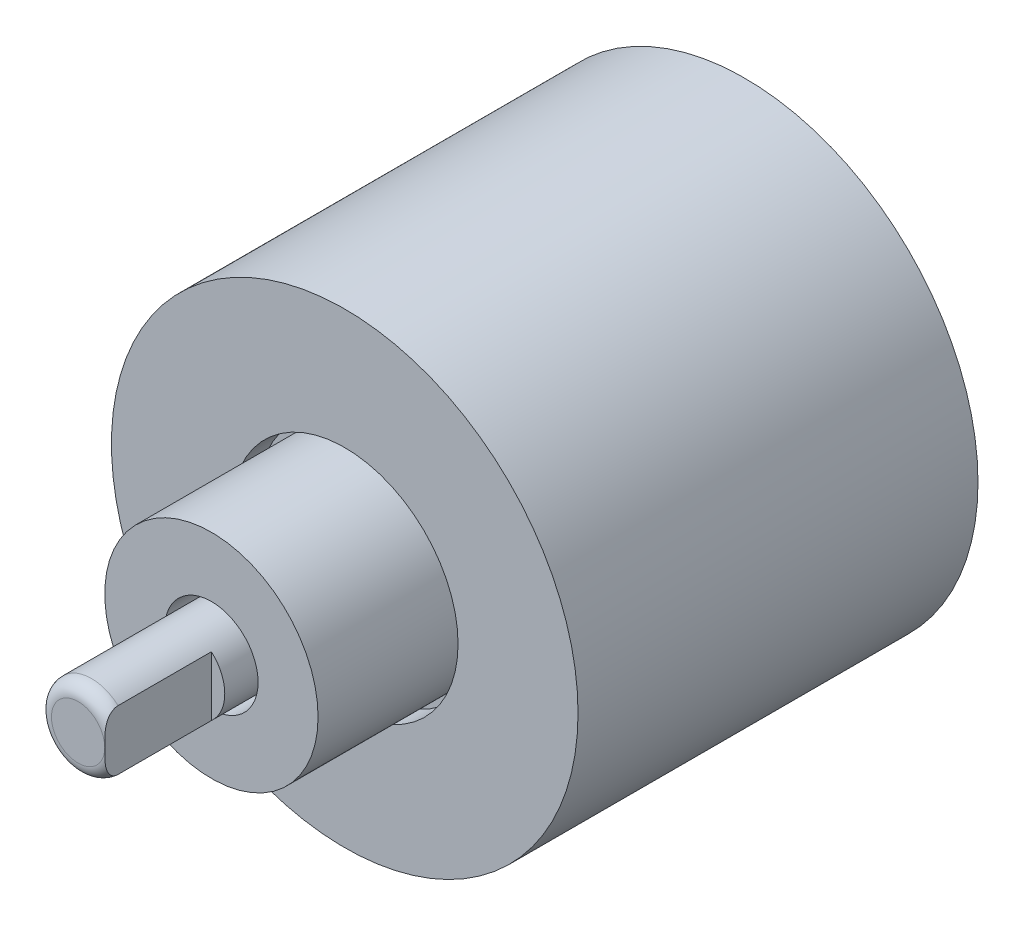
ISO-10303-21;
HEADER;
FILE_DESCRIPTION(('STEP AP214'),'2;1');
FILE_NAME('part.step','',(''),(''),'','','');
FILE_SCHEMA(('AUTOMOTIVE_DESIGN { 1 0 10303 214 1 1 1 1 }'));
ENDSEC;
DATA;
#1=APPLICATION_CONTEXT('core data for automotive mechanical design processes');
#2=APPLICATION_PROTOCOL_DEFINITION('international standard','automotive_design',2000,#1);
#3=PRODUCT_CONTEXT('',#1,'mechanical');
#4=PRODUCT('Part','Part','',(#3));
#5=PRODUCT_RELATED_PRODUCT_CATEGORY('part','',(#4));
#6=PRODUCT_DEFINITION_FORMATION('','',#4);
#7=PRODUCT_DEFINITION_CONTEXT('part definition',#1,'design');
#8=PRODUCT_DEFINITION('design','',#6,#7);
#9=PRODUCT_DEFINITION_SHAPE('','',#8);
#10=(LENGTH_UNIT() NAMED_UNIT(*) SI_UNIT(.MILLI.,.METRE.));
#11=(NAMED_UNIT(*) PLANE_ANGLE_UNIT() SI_UNIT($,.RADIAN.));
#12=(NAMED_UNIT(*) SI_UNIT($,.STERADIAN.) SOLID_ANGLE_UNIT());
#13=UNCERTAINTY_MEASURE_WITH_UNIT(LENGTH_MEASURE(1.E-05),#10,'distance_accuracy_value','');
#14=(GEOMETRIC_REPRESENTATION_CONTEXT(3) GLOBAL_UNCERTAINTY_ASSIGNED_CONTEXT((#13)) GLOBAL_UNIT_ASSIGNED_CONTEXT((#10,
#11,#12)) REPRESENTATION_CONTEXT('',''));
#15=CARTESIAN_POINT('',(0.,0.,0.));
#16=DIRECTION('',(0.,0.,1.));
#17=DIRECTION('',(1.,0.,0.));
#18=AXIS2_PLACEMENT_3D('',#15,#16,#17);
#19=CARTESIAN_POINT('',(0.,0.,40.));
#20=DIRECTION('',(0.,0.,1.));
#21=DIRECTION('',(1.,0.,0.));
#22=AXIS2_PLACEMENT_3D('',#19,#20,#21);
#23=PLANE('',#22);
#24=CARTESIAN_POINT('',(0.,0.,40.));
#25=DIRECTION('',(0.,0.,1.));
#26=DIRECTION('',(1.,0.,0.));
#27=AXIS2_PLACEMENT_3D('',#24,#25,#26);
#28=CIRCLE('',#27,3.5);
#29=CARTESIAN_POINT('',(3.5,0.,40.));
#30=VERTEX_POINT('',#29);
#31=EDGE_CURVE('E149',#30,#30,#28,.T.);
#32=ORIENTED_EDGE('',*,*,#31,.F.);
#33=EDGE_LOOP('',(#32));
#34=FACE_BOUND('',#33,.T.);
#35=CARTESIAN_POINT('',(0.,0.,40.));
#36=DIRECTION('',(0.,0.,1.));
#37=DIRECTION('',(1.,0.,0.));
#38=AXIS2_PLACEMENT_3D('',#35,#36,#37);
#39=CIRCLE('',#38,8.);
#40=CARTESIAN_POINT('',(8.,0.,40.));
#41=VERTEX_POINT('',#40);
#42=EDGE_CURVE('E133',#41,#41,#39,.T.);
#43=ORIENTED_EDGE('',*,*,#42,.T.);
#44=EDGE_LOOP('',(#43));
#45=FACE_BOUND('',#44,.T.);
#46=ADVANCED_FACE('F34',(#34,#45),#23,.T.);
#47=CARTESIAN_POINT('',(0.,0.,30.));
#48=DIRECTION('',(0.,0.,1.));
#49=DIRECTION('',(1.,0.,0.));
#50=AXIS2_PLACEMENT_3D('',#47,#48,#49);
#51=PLANE('',#50);
#52=CARTESIAN_POINT('',(0.,0.,30.));
#53=DIRECTION('',(0.,0.,1.));
#54=DIRECTION('',(1.,0.,0.));
#55=AXIS2_PLACEMENT_3D('',#52,#53,#54);
#56=CIRCLE('',#55,8.5);
#57=CARTESIAN_POINT('',(8.5,0.,30.));
#58=VERTEX_POINT('',#57);
#59=EDGE_CURVE('E140',#58,#58,#56,.T.);
#60=ORIENTED_EDGE('',*,*,#59,.F.);
#61=EDGE_LOOP('',(#60));
#62=FACE_BOUND('',#61,.T.);
#63=CARTESIAN_POINT('',(0.,0.,30.));
#64=DIRECTION('',(0.,0.,1.));
#65=DIRECTION('',(1.,0.,0.));
#66=AXIS2_PLACEMENT_3D('',#63,#64,#65);
#67=CIRCLE('',#66,17.5);
#68=CARTESIAN_POINT('',(17.5,0.,30.));
#69=VERTEX_POINT('',#68);
#70=EDGE_CURVE('E73',#69,#69,#67,.T.);
#71=ORIENTED_EDGE('',*,*,#70,.T.);
#72=EDGE_LOOP('',(#71));
#73=FACE_BOUND('',#72,.T.);
#74=ADVANCED_FACE('F114',(#62,#73),#51,.T.);
#75=CARTESIAN_POINT('',(0.,0.,30.));
#76=DIRECTION('',(0.,0.,-1.));
#77=DIRECTION('',(-1.,0.,0.));
#78=AXIS2_PLACEMENT_3D('',#75,#76,#77);
#79=CYLINDRICAL_SURFACE('',#78,17.5);
#80=ORIENTED_EDGE('',*,*,#70,.F.);
#81=EDGE_LOOP('',(#80));
#82=FACE_BOUND('',#81,.T.);
#83=CARTESIAN_POINT('',(0.,0.,0.));
#84=DIRECTION('',(0.,0.,1.));
#85=DIRECTION('',(1.,0.,0.));
#86=AXIS2_PLACEMENT_3D('',#83,#84,#85);
#87=CIRCLE('',#86,17.5);
#88=CARTESIAN_POINT('',(17.5,0.,0.));
#89=VERTEX_POINT('',#88);
#90=EDGE_CURVE('E77',#89,#89,#87,.T.);
#91=ORIENTED_EDGE('',*,*,#90,.T.);
#92=EDGE_LOOP('',(#91));
#93=FACE_BOUND('',#92,.T.);
#94=ADVANCED_FACE('F121',(#82,#93),#79,.T.);
#95=CARTESIAN_POINT('',(0.,0.,0.));
#96=DIRECTION('',(0.,0.,1.));
#97=DIRECTION('',(1.,0.,0.));
#98=AXIS2_PLACEMENT_3D('',#95,#96,#97);
#99=PLANE('',#98);
#100=ORIENTED_EDGE('',*,*,#90,.F.);
#101=EDGE_LOOP('',(#100));
#102=FACE_BOUND('',#101,.T.);
#103=ADVANCED_FACE('F110',(#102),#99,.F.);
#104=CARTESIAN_POINT('',(0.,0.,28.));
#105=DIRECTION('',(0.,0.,1.));
#106=DIRECTION('',(1.,0.,0.));
#107=AXIS2_PLACEMENT_3D('',#104,#105,#106);
#108=CYLINDRICAL_SURFACE('',#107,8.5);
#109=CARTESIAN_POINT('',(0.,0.,28.));
#110=DIRECTION('',(0.,0.,1.));
#111=DIRECTION('',(1.,0.,0.));
#112=AXIS2_PLACEMENT_3D('',#109,#110,#111);
#113=CIRCLE('',#112,8.5);
#114=CARTESIAN_POINT('',(8.5,0.,28.));
#115=VERTEX_POINT('',#114);
#116=EDGE_CURVE('E135',#115,#115,#113,.T.);
#117=ORIENTED_EDGE('',*,*,#116,.F.);
#118=EDGE_LOOP('',(#117));
#119=FACE_BOUND('',#118,.T.);
#120=ORIENTED_EDGE('',*,*,#59,.T.);
#121=EDGE_LOOP('',(#120));
#122=FACE_BOUND('',#121,.T.);
#123=ADVANCED_FACE('F106',(#119,#122),#108,.F.);
#124=CARTESIAN_POINT('',(0.,0.,28.));
#125=DIRECTION('',(0.,0.,1.));
#126=DIRECTION('',(1.,0.,0.));
#127=AXIS2_PLACEMENT_3D('',#124,#125,#126);
#128=PLANE('',#127);
#129=CARTESIAN_POINT('',(0.,0.,28.));
#130=DIRECTION('',(0.,0.,1.));
#131=DIRECTION('',(1.,0.,0.));
#132=AXIS2_PLACEMENT_3D('',#129,#130,#131);
#133=CIRCLE('',#132,8.);
#134=CARTESIAN_POINT('',(8.,0.,28.));
#135=VERTEX_POINT('',#134);
#136=EDGE_CURVE('E144',#135,#135,#133,.T.);
#137=ORIENTED_EDGE('',*,*,#136,.F.);
#138=EDGE_LOOP('',(#137));
#139=FACE_BOUND('',#138,.T.);
#140=ORIENTED_EDGE('',*,*,#116,.T.);
#141=EDGE_LOOP('',(#140));
#142=FACE_BOUND('',#141,.T.);
#143=ADVANCED_FACE('F103',(#139,#142),#128,.T.);
#144=CARTESIAN_POINT('',(0.,0.,40.));
#145=DIRECTION('',(0.,0.,-1.));
#146=DIRECTION('',(-1.,0.,0.));
#147=AXIS2_PLACEMENT_3D('',#144,#145,#146);
#148=CYLINDRICAL_SURFACE('',#147,8.);
#149=ORIENTED_EDGE('',*,*,#42,.F.);
#150=EDGE_LOOP('',(#149));
#151=FACE_BOUND('',#150,.T.);
#152=ORIENTED_EDGE('',*,*,#136,.T.);
#153=EDGE_LOOP('',(#152));
#154=FACE_BOUND('',#153,.T.);
#155=ADVANCED_FACE('F95',(#151,#154),#148,.T.);
#156=CARTESIAN_POINT('',(0.,0.,28.));
#157=DIRECTION('',(0.,0.,1.));
#158=DIRECTION('',(1.,0.,0.));
#159=AXIS2_PLACEMENT_3D('',#156,#157,#158);
#160=CYLINDRICAL_SURFACE('',#159,3.5);
#161=CARTESIAN_POINT('',(0.,0.,28.));
#162=DIRECTION('',(0.,0.,1.));
#163=DIRECTION('',(1.,0.,0.));
#164=AXIS2_PLACEMENT_3D('',#161,#162,#163);
#165=CIRCLE('',#164,3.5);
#166=CARTESIAN_POINT('',(3.5,0.,28.));
#167=VERTEX_POINT('',#166);
#168=EDGE_CURVE('E148',#167,#167,#165,.T.);
#169=ORIENTED_EDGE('',*,*,#168,.F.);
#170=EDGE_LOOP('',(#169));
#171=FACE_BOUND('',#170,.T.);
#172=ORIENTED_EDGE('',*,*,#31,.T.);
#173=EDGE_LOOP('',(#172));
#174=FACE_BOUND('',#173,.T.);
#175=ADVANCED_FACE('F91',(#171,#174),#160,.F.);
#176=CARTESIAN_POINT('',(0.,0.,28.));
#177=DIRECTION('',(0.,0.,1.));
#178=DIRECTION('',(1.,0.,0.));
#179=AXIS2_PLACEMENT_3D('',#176,#177,#178);
#180=PLANE('',#179);
#181=CARTESIAN_POINT('',(0.,0.,28.));
#182=DIRECTION('',(0.,0.,1.));
#183=DIRECTION('',(1.,0.,0.));
#184=AXIS2_PLACEMENT_3D('',#181,#182,#183);
#185=CIRCLE('',#184,3.);
#186=CARTESIAN_POINT('',(3.,0.,28.));
#187=VERTEX_POINT('',#186);
#188=EDGE_CURVE('E152',#187,#187,#185,.T.);
#189=ORIENTED_EDGE('',*,*,#188,.F.);
#190=EDGE_LOOP('',(#189));
#191=FACE_BOUND('',#190,.T.);
#192=ORIENTED_EDGE('',*,*,#168,.T.);
#193=EDGE_LOOP('',(#192));
#194=FACE_BOUND('',#193,.T.);
#195=ADVANCED_FACE('F88',(#191,#194),#180,.T.);
#196=CARTESIAN_POINT('',(0.,0.,50.));
#197=DIRECTION('',(0.,0.,1.));
#198=DIRECTION('',(1.,0.,0.));
#199=AXIS2_PLACEMENT_3D('',#196,#197,#198);
#200=PLANE('',#199);
#201=CARTESIAN_POINT('',(0.,0.,50.));
#202=DIRECTION('',(0.,0.,1.));
#203=DIRECTION('',(1.,0.,0.));
#204=AXIS2_PLACEMENT_3D('',#201,#202,#203);
#205=CIRCLE('',#204,2.);
#206=CARTESIAN_POINT('',(2.,0.,50.));
#207=VERTEX_POINT('',#206);
#208=EDGE_CURVE('E70',#207,#207,#205,.T.);
#209=ORIENTED_EDGE('',*,*,#208,.T.);
#210=EDGE_LOOP('',(#209));
#211=FACE_BOUND('',#210,.T.);
#212=ADVANCED_FACE('F72',(#211),#200,.T.);
#213=CARTESIAN_POINT('',(0.,0.,50.));
#214=DIRECTION('',(0.,0.,-1.));
#215=DIRECTION('',(-1.,0.,0.));
#216=AXIS2_PLACEMENT_3D('',#213,#214,#215);
#217=CYLINDRICAL_SURFACE('',#216,3.);
#218=CARTESIAN_POINT('',(0.,0.,49.));
#219=DIRECTION('',(0.,0.,1.));
#220=DIRECTION('',(1.,0.,0.));
#221=AXIS2_PLACEMENT_3D('',#218,#219,#220);
#222=CIRCLE('',#221,3.);
#223=CARTESIAN_POINT('',(2.,-2.23606797750535,48.9999999999928));
#224=VERTEX_POINT('',#223);
#225=CARTESIAN_POINT('',(2.,2.23606797749979,49.));
#226=VERTEX_POINT('',#225);
#227=EDGE_CURVE('E68',#224,#226,#222,.F.);
#228=ORIENTED_EDGE('',*,*,#227,.T.);
#229=DIRECTION('',(0.,0.,-1.));
#230=VECTOR('',#229,1.);
#231=CARTESIAN_POINT('',(2.,2.23606797749979,50.));
#232=LINE('',#231,#230);
#233=CARTESIAN_POINT('',(2.,2.23606797749979,42.));
#234=VERTEX_POINT('',#233);
#235=EDGE_CURVE('E50',#226,#234,#232,.T.);
#236=ORIENTED_EDGE('',*,*,#235,.T.);
#237=CARTESIAN_POINT('',(0.,0.,42.));
#238=DIRECTION('',(0.,0.,1.));
#239=DIRECTION('',(1.,0.,0.));
#240=AXIS2_PLACEMENT_3D('',#237,#238,#239);
#241=CIRCLE('',#240,3.);
#242=CARTESIAN_POINT('',(2.,-2.23606797749979,42.));
#243=VERTEX_POINT('',#242);
#244=EDGE_CURVE('E11',#243,#234,#241,.T.);
#245=ORIENTED_EDGE('',*,*,#244,.F.);
#246=DIRECTION('',(0.,0.,-1.));
#247=VECTOR('',#246,1.);
#248=CARTESIAN_POINT('',(2.,-2.23606797749979,50.));
#249=LINE('',#248,#247);
#250=EDGE_CURVE('E158',#243,#224,#249,.F.);
#251=ORIENTED_EDGE('',*,*,#250,.T.);
#252=EDGE_LOOP('',(#228,#236,#245,#251));
#253=FACE_BOUND('',#252,.T.);
#254=ORIENTED_EDGE('',*,*,#188,.T.);
#255=EDGE_LOOP('',(#254));
#256=FACE_BOUND('',#255,.T.);
#257=ADVANCED_FACE('F99',(#253,#256),#217,.T.);
#258=CARTESIAN_POINT('',(0.,0.,49.));
#259=DIRECTION('',(0.,0.,1.));
#260=DIRECTION('',(1.,0.,0.));
#261=AXIS2_PLACEMENT_3D('',#258,#259,#260);
#262=TOROIDAL_SURFACE('',#261,2.,1.);
#263=CARTESIAN_POINT('',(2.,0.,50.0000000000001));
#264=CARTESIAN_POINT('',(2.,-0.076369020157945,50.0000031260203));
#265=CARTESIAN_POINT('',(2.,-0.15273795887089,50.0000297647489));
#266=CARTESIAN_POINT('',(2.,-0.30550208792561,49.9997991091442));
#267=CARTESIAN_POINT('',(2.,-0.3818972782169,49.9995417166634));
#268=CARTESIAN_POINT('',(2.,-0.53464918810855,49.9977699273087));
#269=CARTESIAN_POINT('',(2.,-0.611005910305188,49.9962560625543));
#270=CARTESIAN_POINT('',(2.,-0.763603191132545,49.9905207230734));
#271=CARTESIAN_POINT('',(2.,-0.839843780977737,49.9863001923551));
#272=CARTESIAN_POINT('',(2.,-1.02282452544189,49.9707774862482));
#273=CARTESIAN_POINT('',(2.,-1.12941068091382,49.9572994048073));
#274=CARTESIAN_POINT('',(2.,-1.33981032054741,49.9159195710441));
#275=CARTESIAN_POINT('',(2.,-1.44363117546361,49.8880612927642));
#276=CARTESIAN_POINT('',(2.,-1.60465989302366,49.8271336232096));
#277=CARTESIAN_POINT('',(2.,-1.66421819416825,49.8003631247555));
#278=CARTESIAN_POINT('',(2.,-1.77878795279052,49.7382858238152));
#279=CARTESIAN_POINT('',(2.,-1.83380269419827,49.7029852603151));
#280=CARTESIAN_POINT('',(2.,-1.9273492643924,49.6305568216485));
#281=CARTESIAN_POINT('',(2.,-1.96705327106964,49.594952773781));
#282=CARTESIAN_POINT('',(2.,-2.04010800390442,49.517711116836));
#283=CARTESIAN_POINT('',(2.,-2.07346568636703,49.4760802031087));
#284=CARTESIAN_POINT('',(2.,-2.1275996226266,49.39413804897));
#285=CARTESIAN_POINT('',(2.,-2.14951628543093,49.3545822023543));
#286=CARTESIAN_POINT('',(2.,-2.18644320933429,49.2723503950039));
#287=CARTESIAN_POINT('',(2.,-2.20145595018777,49.2296755609416));
#288=CARTESIAN_POINT('',(2.,-2.22378570801741,49.1421686559964));
#289=CARTESIAN_POINT('',(2.,-2.2310735088338,49.0973290612365));
#290=CARTESIAN_POINT('',(2.,-2.23740369339417,49.0070686452831));
#291=CARTESIAN_POINT('',(2.,-2.23644722750139,48.9616479060628));
#292=CARTESIAN_POINT('',(2.,-2.2266979900092,48.874775462273));
#293=CARTESIAN_POINT('',(2.,-2.21843760164092,48.8332625454801));
#294=CARTESIAN_POINT('',(2.,-2.19524767876124,48.7521660547158));
#295=CARTESIAN_POINT('',(2.,-2.1803193172638,48.7125821427564));
#296=CARTESIAN_POINT('',(2.,-2.14400374636997,48.6351603316816));
#297=CARTESIAN_POINT('',(2.,-2.12244763087506,48.5974021872077));
#298=CARTESIAN_POINT('',(2.,-2.07397660738421,48.5254928822635));
#299=CARTESIAN_POINT('',(2.,-2.04705672011998,48.4913451187874));
#300=CARTESIAN_POINT('',(2.,-1.9774745620411,48.4144876197601));
#301=CARTESIAN_POINT('',(2.,-1.93276543514968,48.3736262500248));
#302=CARTESIAN_POINT('',(2.,-1.83736503074922,48.2997833612921));
#303=CARTESIAN_POINT('',(2.,-1.78667039098229,48.2668063029314));
#304=CARTESIAN_POINT('',(2.,-1.65755060113883,48.1950450964826));
#305=CARTESIAN_POINT('',(2.,-1.57688820544369,48.1602932906918));
#306=CARTESIAN_POINT('',(2.,-1.45270991776211,48.1177691390603));
#307=CARTESIAN_POINT('',(2.,-1.41068935514643,48.1051777883923));
#308=CARTESIAN_POINT('',(2.,-1.32592791102742,48.0828210089803));
#309=CARTESIAN_POINT('',(2.,-1.28318763302977,48.0730533262841));
#310=CARTESIAN_POINT('',(2.,-1.1623760038983,48.049003837419));
#311=CARTESIAN_POINT('',(2.,-1.08376246780473,48.0374855327919));
#312=CARTESIAN_POINT('',(2.,-0.925890527213634,48.0200972361683));
#313=CARTESIAN_POINT('',(2.,-0.846631470052604,48.0142339398083));
#314=CARTESIAN_POINT('',(2.,-0.687599323391151,48.0060529664179));
#315=CARTESIAN_POINT('',(2.,-0.607825521634623,48.0037512886475));
#316=CARTESIAN_POINT('',(2.,-0.448294559192548,48.0009516306244));
#317=CARTESIAN_POINT('',(2.,-0.368537406847105,48.0004528499023));
#318=CARTESIAN_POINT('',(2.,-0.207997257710171,47.9999743261313));
#319=CARTESIAN_POINT('',(2.,-0.127214260505595,48.0000013412977));
#320=CARTESIAN_POINT('',(2.,0.0343623119036933,47.9999989489513));
#321=CARTESIAN_POINT('',(2.,0.115155887106133,47.9999695340379));
#322=CARTESIAN_POINT('',(2.,0.276559374279781,48.0001219961179));
#323=CARTESIAN_POINT('',(2.,0.35716928575384,48.0003033923752));
#324=CARTESIAN_POINT('',(2.,0.518370906797121,48.0019399026832));
#325=CARTESIAN_POINT('',(2.,0.598962617244549,48.0033948181088));
#326=CARTESIAN_POINT('',(2.,0.76038625998127,48.0092643004461));
#327=CARTESIAN_POINT('',(2.,0.841217849219269,48.0136907874064));
#328=CARTESIAN_POINT('',(2.,1.0025698279958,48.0276397836555));
#329=CARTESIAN_POINT('',(2.,1.08308984694649,48.0371671520206));
#330=CARTESIAN_POINT('',(2.,1.2415970266603,48.0634793921316));
#331=CARTESIAN_POINT('',(2.,1.31960397352607,48.0801380517792));
#332=CARTESIAN_POINT('',(2.,1.47288045997657,48.1230423579544));
#333=CARTESIAN_POINT('',(2.,1.54815652165872,48.1492632468352));
#334=CARTESIAN_POINT('',(2.,1.66972253330178,48.2029613141163));
#335=CARTESIAN_POINT('',(2.,1.71742922784354,48.2272125462674));
#336=CARTESIAN_POINT('',(2.,1.80958007407403,48.2816856644554));
#337=CARTESIAN_POINT('',(2.,1.85401271285417,48.3119273578353));
#338=CARTESIAN_POINT('',(2.,1.93827461355735,48.3788559560311));
#339=CARTESIAN_POINT('',(2.,1.97807154541756,48.4155840962311));
#340=CARTESIAN_POINT('',(2.,2.05089913663341,48.495192389132));
#341=CARTESIAN_POINT('',(2.,2.0839427894881,48.53806045279));
#342=CARTESIAN_POINT('',(2.,2.13652890778743,48.6214478083617));
#343=CARTESIAN_POINT('',(2.,2.15741306404384,48.6611195869266));
#344=CARTESIAN_POINT('',(2.,2.19227703261405,48.7434135384702));
#345=CARTESIAN_POINT('',(2.,2.20625819960887,48.7860351306877));
#346=CARTESIAN_POINT('',(2.,2.22657328384413,48.8732326470674));
#347=CARTESIAN_POINT('',(2.,2.2328809138889,48.9178147500979));
#348=CARTESIAN_POINT('',(2.,2.23737759894245,49.0073856738781));
#349=CARTESIAN_POINT('',(2.,2.2355680851902,49.0523744215309));
#350=CARTESIAN_POINT('',(2.,2.22430197869589,49.1385996125589));
#351=CARTESIAN_POINT('',(2.,2.2153139501423,49.1798985520142));
#352=CARTESIAN_POINT('',(2.,2.19075054288833,49.2604714660658));
#353=CARTESIAN_POINT('',(2.,2.17517529820238,49.2997454818402));
#354=CARTESIAN_POINT('',(2.,2.13754184493679,49.3766895255966));
#355=CARTESIAN_POINT('',(2.,2.11528224730095,49.414260424571));
#356=CARTESIAN_POINT('',(2.,2.06547099850045,49.4856982779254));
#357=CARTESIAN_POINT('',(2.,2.03791626168742,49.5195630544799));
#358=CARTESIAN_POINT('',(2.,1.96655250220946,49.596054763067));
#359=CARTESIAN_POINT('',(2.,1.92065899118761,49.6367414955395));
#360=CARTESIAN_POINT('',(2.,1.82289379758913,49.7100981395385));
#361=CARTESIAN_POINT('',(2.,1.77101286693525,49.7427553986092));
#362=CARTESIAN_POINT('',(2.,1.63833374712565,49.8139853544146));
#363=CARTESIAN_POINT('',(2.,1.55526643381857,49.8482988620794));
#364=CARTESIAN_POINT('',(2.,1.38494496061082,49.9038470097144));
#365=CARTESIAN_POINT('',(2.,1.29768171547594,49.925051752122));
#366=CARTESIAN_POINT('',(2.,1.11043297168095,49.9597735763074));
#367=CARTESIAN_POINT('',(2.,1.010222551569,49.9719957068406));
#368=CARTESIAN_POINT('',(2.,0.809103844384414,49.9887492302766));
#369=CARTESIAN_POINT('',(2.,0.708194605437376,49.9932662635087));
#370=CARTESIAN_POINT('',(2.,0.506026142890775,49.9985963913547));
#371=CARTESIAN_POINT('',(2.,0.404766744127078,49.9993988492816));
#372=CARTESIAN_POINT('',(2.,0.252924411035532,49.9999071248459));
#373=CARTESIAN_POINT('',(2.,0.202339556891743,49.99996077272));
#374=CARTESIAN_POINT('',(2.,0.101169789918748,50.0000061747685));
#375=CARTESIAN_POINT('',(2.,0.0505848770927953,49.9999979294046));
#376=CARTESIAN_POINT('',(2.,0.,50.0000000000001));
#377=B_SPLINE_CURVE_WITH_KNOTS('',3,(#263,#264,#265,#266,#267,#268,#269,#270,#271,#272,#273,
#274,#275,#276,#277,#278,#279,#280,#281,#282,#283,#284,#285,#286,#287,#288,#289,#290,#291,#292,
#293,#294,#295,#296,#297,#298,#299,#300,#301,#302,#303,#304,#305,#306,#307,#308,#309,#310,#311,
#312,#313,#314,#315,#316,#317,#318,#319,#320,#321,#322,#323,#324,#325,#326,#327,#328,#329,#330,
#331,#332,#333,#334,#335,#336,#337,#338,#339,#340,#341,#342,#343,#344,#345,#346,#347,#348,#349,
#350,#351,#352,#353,#354,#355,#356,#357,#358,#359,#360,#361,#362,#363,#364,#365,#366,#367,#368,
#369,#370,#371,#372,#373,#374,#375,#376),.UNSPECIFIED.,.T.,.F.,(4,2,2,2,2,2,2,2,2,2,2,2,2,2,2,2,
2,2,2,2,2,2,2,2,2,2,2,2,2,2,2,2,2,2,2,2,2,2,2,2,2,2,2,2,2,2,2,2,2,2,2,2,2,2,2,2,4),(0.,
0.229106840538628,0.458292874138534,0.687381896313583,0.91639106216125,1.23815597457608,
1.55895377924827,1.75429176484323,1.94948730819381,2.10886623600976,2.26806944668111,
2.40315617384782,2.53819434252027,2.67374143053741,2.80926960530657,2.93566537209127,
3.06203891238542,3.19194556770035,3.32197338389568,3.50266640587622,3.68346141630092,
3.9453689360274,4.07690904605721,4.20834386430539,4.44637284973331,4.68468332124435,
4.92406123866952,5.16333286147463,5.40568192339744,5.64806277132444,5.88989197396991,
6.13168346630335,6.37445071383767,6.61744963289064,6.85631496994819,7.09456619931371,
7.25476227003689,7.41549714386209,7.57729324847222,7.73877505972666,7.87270062765759,
8.00659990283286,8.14095659597757,8.27528959988121,8.40150753737124,8.52772290712876,
8.6582057198848,8.78876480103069,8.97173716740419,9.15499603111545,9.42308365139408,
9.69178047307733,9.99411960355138,10.297021577814,10.6007903775742,10.7525459954131,
10.904300481012),.UNSPECIFIED.);
#378=EDGE_CURVE('E43',#207,#224,#377,.T.);
#379=ORIENTED_EDGE('',*,*,#378,.F.);
#380=ORIENTED_EDGE('',*,*,#208,.F.);
#381=EDGE_CURVE('E62',#226,#207,#377,.T.);
#382=ORIENTED_EDGE('',*,*,#381,.F.);
#383=ORIENTED_EDGE('',*,*,#227,.F.);
#384=EDGE_LOOP('',(#379,#380,#382,#383));
#385=FACE_BOUND('',#384,.T.);
#386=ADVANCED_FACE('F36',(#385),#262,.T.);
#387=CARTESIAN_POINT('',(0.,0.,42.));
#388=DIRECTION('',(0.,0.,1.));
#389=DIRECTION('',(1.,0.,0.));
#390=AXIS2_PLACEMENT_3D('',#387,#388,#389);
#391=PLANE('',#390);
#392=ORIENTED_EDGE('',*,*,#244,.T.);
#393=DIRECTION('',(0.,-1.,0.));
#394=VECTOR('',#393,1.);
#395=CARTESIAN_POINT('',(2.,3.67741384959364,42.));
#396=LINE('',#395,#394);
#397=EDGE_CURVE('E160',#234,#243,#396,.T.);
#398=ORIENTED_EDGE('',*,*,#397,.T.);
#399=EDGE_LOOP('',(#392,#398));
#400=FACE_BOUND('',#399,.T.);
#401=ADVANCED_FACE('F87',(#400),#391,.T.);
#402=CARTESIAN_POINT('',(2.,3.67741384959364,42.));
#403=DIRECTION('',(-1.,0.,0.));
#404=DIRECTION('',(0.,-1.,0.));
#405=AXIS2_PLACEMENT_3D('',#402,#403,#404);
#406=PLANE('',#405);
#407=ORIENTED_EDGE('',*,*,#381,.T.);
#408=ORIENTED_EDGE('',*,*,#378,.T.);
#409=ORIENTED_EDGE('',*,*,#250,.F.);
#410=ORIENTED_EDGE('',*,*,#397,.F.);
#411=ORIENTED_EDGE('',*,*,#235,.F.);
#412=EDGE_LOOP('',(#407,#408,#409,#410,#411));
#413=FACE_BOUND('',#412,.T.);
#414=ADVANCED_FACE('F63',(#413),#406,.F.);
#415=CLOSED_SHELL('',(#46,#74,#94,#103,#123,#143,#155,#175,#195,#212,#257,#386,#401,#414));
#416=MANIFOLD_SOLID_BREP('B2',#415);
#417=ADVANCED_BREP_SHAPE_REPRESENTATION('',(#18,#416),#14);
#418=SHAPE_DEFINITION_REPRESENTATION(#9,#417);
ENDSEC;
END-ISO-10303-21;
